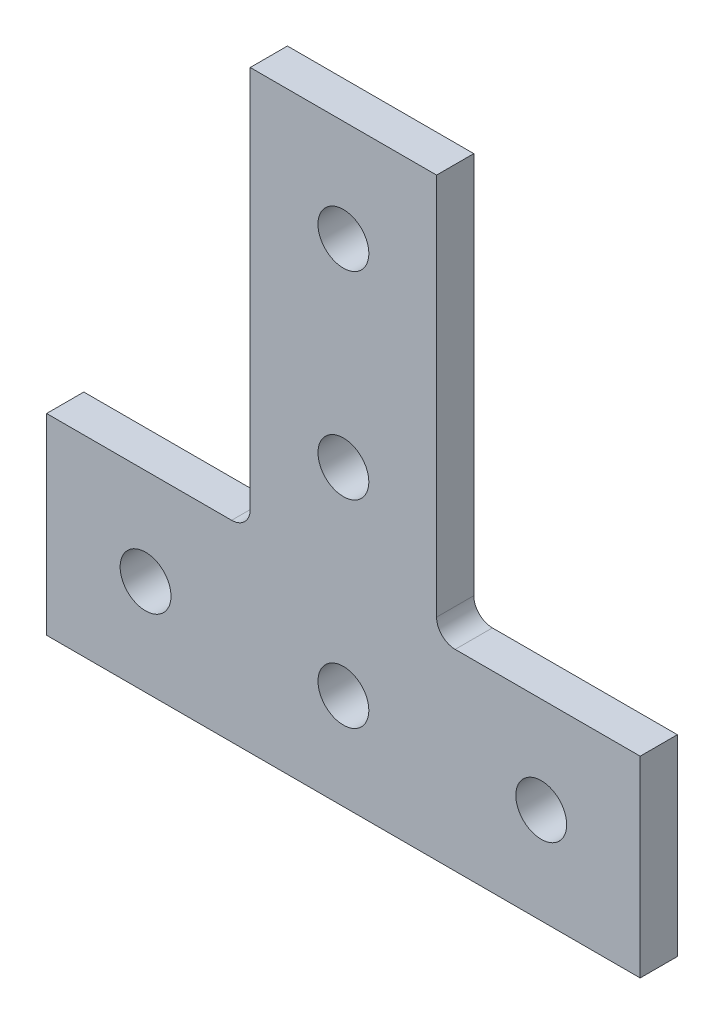
ISO-10303-21;
HEADER;
FILE_DESCRIPTION(('STEP AP214'),'2;1');
FILE_NAME('part.step','',(''),(''),'','','');
FILE_SCHEMA(('AUTOMOTIVE_DESIGN { 1 0 10303 214 1 1 1 1 }'));
ENDSEC;
DATA;
#1=APPLICATION_CONTEXT('core data for automotive mechanical design processes');
#2=APPLICATION_PROTOCOL_DEFINITION('international standard','automotive_design',2000,#1);
#3=PRODUCT_CONTEXT('',#1,'mechanical');
#4=PRODUCT('Part','Part','',(#3));
#5=PRODUCT_RELATED_PRODUCT_CATEGORY('part','',(#4));
#6=PRODUCT_DEFINITION_FORMATION('','',#4);
#7=PRODUCT_DEFINITION_CONTEXT('part definition',#1,'design');
#8=PRODUCT_DEFINITION('design','',#6,#7);
#9=PRODUCT_DEFINITION_SHAPE('','',#8);
#10=(LENGTH_UNIT() NAMED_UNIT(*) SI_UNIT(.MILLI.,.METRE.));
#11=(NAMED_UNIT(*) PLANE_ANGLE_UNIT() SI_UNIT($,.RADIAN.));
#12=(NAMED_UNIT(*) SI_UNIT($,.STERADIAN.) SOLID_ANGLE_UNIT());
#13=UNCERTAINTY_MEASURE_WITH_UNIT(LENGTH_MEASURE(1.E-05),#10,'distance_accuracy_value','');
#14=(GEOMETRIC_REPRESENTATION_CONTEXT(3) GLOBAL_UNCERTAINTY_ASSIGNED_CONTEXT((#13)) GLOBAL_UNIT_ASSIGNED_CONTEXT((#10,
#11,#12)) REPRESENTATION_CONTEXT('',''));
#15=CARTESIAN_POINT('',(0.,0.,0.));
#16=DIRECTION('',(0.,0.,1.));
#17=DIRECTION('',(1.,0.,0.));
#18=AXIS2_PLACEMENT_3D('',#15,#16,#17);
#19=CARTESIAN_POINT('',(-11.9634,-11.049,-2.3876));
#20=DIRECTION('',(-1.,0.,0.));
#21=DIRECTION('',(0.,-1.,0.));
#22=AXIS2_PLACEMENT_3D('',#19,#20,#21);
#23=PLANE('',#22);
#24=DIRECTION('',(0.,0.,1.));
#25=VECTOR('',#24,1.);
#26=CARTESIAN_POINT('',(-11.9634,-11.049,-2.3876));
#27=LINE('',#26,#25);
#28=CARTESIAN_POINT('',(-11.9634,-11.049,-2.3876));
#29=VERTEX_POINT('',#28);
#30=CARTESIAN_POINT('',(-11.9634,-11.049,2.3876));
#31=VERTEX_POINT('',#30);
#32=EDGE_CURVE('E48',#29,#31,#27,.T.);
#33=ORIENTED_EDGE('',*,*,#32,.T.);
#34=DIRECTION('',(0.,-1.,0.));
#35=VECTOR('',#34,1.);
#36=CARTESIAN_POINT('',(-11.9634,-11.049,2.3876));
#37=LINE('',#36,#35);
#38=CARTESIAN_POINT('',(-11.9634,38.1,2.3876));
#39=VERTEX_POINT('',#38);
#40=EDGE_CURVE('E122',#39,#31,#37,.T.);
#41=ORIENTED_EDGE('',*,*,#40,.F.);
#42=DIRECTION('',(0.,0.,1.));
#43=VECTOR('',#42,1.);
#44=CARTESIAN_POINT('',(-11.9634,38.1,-2.3876));
#45=LINE('',#44,#43);
#46=CARTESIAN_POINT('',(-11.9634,38.1,-2.3876));
#47=VERTEX_POINT('',#46);
#48=EDGE_CURVE('E11',#47,#39,#45,.T.);
#49=ORIENTED_EDGE('',*,*,#48,.F.);
#50=DIRECTION('',(0.,-1.,0.));
#51=VECTOR('',#50,1.);
#52=CARTESIAN_POINT('',(-11.9634,-11.049,-2.3876));
#53=LINE('',#52,#51);
#54=EDGE_CURVE('E123',#47,#29,#53,.T.);
#55=ORIENTED_EDGE('',*,*,#54,.T.);
#56=EDGE_LOOP('',(#33,#41,#49,#55));
#57=FACE_BOUND('',#56,.T.);
#58=ADVANCED_FACE('F45',(#57),#23,.T.);
#59=CARTESIAN_POINT('',(11.9634,38.1,-2.3876));
#60=DIRECTION('',(0.,1.,0.));
#61=DIRECTION('',(-1.,0.,0.));
#62=AXIS2_PLACEMENT_3D('',#59,#60,#61);
#63=PLANE('',#62);
#64=ORIENTED_EDGE('',*,*,#48,.T.);
#65=DIRECTION('',(-1.,0.,0.));
#66=VECTOR('',#65,1.);
#67=CARTESIAN_POINT('',(11.9634,38.1,2.3876));
#68=LINE('',#67,#66);
#69=CARTESIAN_POINT('',(11.9634,38.1,2.3876));
#70=VERTEX_POINT('',#69);
#71=EDGE_CURVE('E142',#70,#39,#68,.T.);
#72=ORIENTED_EDGE('',*,*,#71,.F.);
#73=DIRECTION('',(0.,0.,1.));
#74=VECTOR('',#73,1.);
#75=CARTESIAN_POINT('',(11.9634,38.1,-2.3876));
#76=LINE('',#75,#74);
#77=CARTESIAN_POINT('',(11.9634,38.1,-2.3876));
#78=VERTEX_POINT('',#77);
#79=EDGE_CURVE('E54',#78,#70,#76,.T.);
#80=ORIENTED_EDGE('',*,*,#79,.F.);
#81=DIRECTION('',(-1.,0.,0.));
#82=VECTOR('',#81,1.);
#83=CARTESIAN_POINT('',(11.9634,38.1,-2.3876));
#84=LINE('',#83,#82);
#85=EDGE_CURVE('E129',#78,#47,#84,.T.);
#86=ORIENTED_EDGE('',*,*,#85,.T.);
#87=EDGE_LOOP('',(#64,#72,#80,#86));
#88=FACE_BOUND('',#87,.T.);
#89=ADVANCED_FACE('F312',(#88),#63,.T.);
#90=CARTESIAN_POINT('',(11.9634,-11.049,-2.3876));
#91=DIRECTION('',(1.,0.,0.));
#92=DIRECTION('',(0.,1.,0.));
#93=AXIS2_PLACEMENT_3D('',#90,#91,#92);
#94=PLANE('',#93);
#95=ORIENTED_EDGE('',*,*,#79,.T.);
#96=DIRECTION('',(0.,1.,0.));
#97=VECTOR('',#96,1.);
#98=CARTESIAN_POINT('',(11.9634,-11.049,2.3876));
#99=LINE('',#98,#97);
#100=CARTESIAN_POINT('',(11.9634,-11.049,2.3876));
#101=VERTEX_POINT('',#100);
#102=EDGE_CURVE('E177',#101,#70,#99,.T.);
#103=ORIENTED_EDGE('',*,*,#102,.F.);
#104=DIRECTION('',(0.,0.,1.));
#105=VECTOR('',#104,1.);
#106=CARTESIAN_POINT('',(11.9634,-11.049,-2.3876));
#107=LINE('',#106,#105);
#108=CARTESIAN_POINT('',(11.9634,-11.049,-2.3876));
#109=VERTEX_POINT('',#108);
#110=EDGE_CURVE('E218',#109,#101,#107,.T.);
#111=ORIENTED_EDGE('',*,*,#110,.F.);
#112=DIRECTION('',(0.,1.,0.));
#113=VECTOR('',#112,1.);
#114=CARTESIAN_POINT('',(11.9634,-11.049,-2.3876));
#115=LINE('',#114,#113);
#116=EDGE_CURVE('E211',#109,#78,#115,.T.);
#117=ORIENTED_EDGE('',*,*,#116,.T.);
#118=EDGE_LOOP('',(#95,#103,#111,#117));
#119=FACE_BOUND('',#118,.T.);
#120=ADVANCED_FACE('F316',(#119),#94,.T.);
#121=CARTESIAN_POINT('',(14.351,-11.049,-2.3876));
#122=DIRECTION('',(0.,0.,1.));
#123=DIRECTION('',(1.,0.,0.));
#124=AXIS2_PLACEMENT_3D('',#121,#122,#123);
#125=CYLINDRICAL_SURFACE('',#124,2.3876);
#126=ORIENTED_EDGE('',*,*,#110,.T.);
#127=CARTESIAN_POINT('',(14.351,-11.049,2.3876));
#128=DIRECTION('',(0.,0.,-1.));
#129=DIRECTION('',(-1.,0.,0.));
#130=AXIS2_PLACEMENT_3D('',#127,#128,#129);
#131=CIRCLE('',#130,2.3876);
#132=CARTESIAN_POINT('',(14.351,-13.4366,2.3876));
#133=VERTEX_POINT('',#132);
#134=EDGE_CURVE('E173',#133,#101,#131,.T.);
#135=ORIENTED_EDGE('',*,*,#134,.F.);
#136=DIRECTION('',(0.,0.,1.));
#137=VECTOR('',#136,1.);
#138=CARTESIAN_POINT('',(14.351,-13.4366,-2.3876));
#139=LINE('',#138,#137);
#140=CARTESIAN_POINT('',(14.351,-13.4366,-2.3876));
#141=VERTEX_POINT('',#140);
#142=EDGE_CURVE('E221',#141,#133,#139,.T.);
#143=ORIENTED_EDGE('',*,*,#142,.F.);
#144=CARTESIAN_POINT('',(14.351,-11.049,-2.3876));
#145=DIRECTION('',(0.,0.,-1.));
#146=DIRECTION('',(-1.,0.,0.));
#147=AXIS2_PLACEMENT_3D('',#144,#145,#146);
#148=CIRCLE('',#147,2.3876);
#149=EDGE_CURVE('E207',#141,#109,#148,.T.);
#150=ORIENTED_EDGE('',*,*,#149,.T.);
#151=EDGE_LOOP('',(#126,#135,#143,#150));
#152=FACE_BOUND('',#151,.T.);
#153=ADVANCED_FACE('F321',(#152),#125,.F.);
#154=CARTESIAN_POINT('',(38.1,-13.4366,-2.3876));
#155=DIRECTION('',(0.,1.,0.));
#156=DIRECTION('',(0.,0.,1.));
#157=AXIS2_PLACEMENT_3D('',#154,#155,#156);
#158=PLANE('',#157);
#159=ORIENTED_EDGE('',*,*,#142,.T.);
#160=DIRECTION('',(-1.,0.,0.));
#161=VECTOR('',#160,1.);
#162=CARTESIAN_POINT('',(38.1,-13.4366,2.3876));
#163=LINE('',#162,#161);
#164=CARTESIAN_POINT('',(38.1,-13.4366,2.3876));
#165=VERTEX_POINT('',#164);
#166=EDGE_CURVE('E169',#165,#133,#163,.T.);
#167=ORIENTED_EDGE('',*,*,#166,.F.);
#168=DIRECTION('',(0.,0.,1.));
#169=VECTOR('',#168,1.);
#170=CARTESIAN_POINT('',(38.1,-13.4366,-2.3876));
#171=LINE('',#170,#169);
#172=CARTESIAN_POINT('',(38.1,-13.4366,-2.3876));
#173=VERTEX_POINT('',#172);
#174=EDGE_CURVE('E224',#173,#165,#171,.T.);
#175=ORIENTED_EDGE('',*,*,#174,.F.);
#176=DIRECTION('',(-1.,0.,0.));
#177=VECTOR('',#176,1.);
#178=CARTESIAN_POINT('',(38.1,-13.4366,-2.3876));
#179=LINE('',#178,#177);
#180=EDGE_CURVE('E203',#173,#141,#179,.T.);
#181=ORIENTED_EDGE('',*,*,#180,.T.);
#182=EDGE_LOOP('',(#159,#167,#175,#181));
#183=FACE_BOUND('',#182,.T.);
#184=ADVANCED_FACE('F328',(#183),#158,.T.);
#185=CARTESIAN_POINT('',(38.1,-38.1,-2.3876));
#186=DIRECTION('',(1.,0.,0.));
#187=DIRECTION('',(0.,0.,-1.));
#188=AXIS2_PLACEMENT_3D('',#185,#186,#187);
#189=PLANE('',#188);
#190=ORIENTED_EDGE('',*,*,#174,.T.);
#191=DIRECTION('',(0.,1.,0.));
#192=VECTOR('',#191,1.);
#193=CARTESIAN_POINT('',(38.1,-38.1,2.3876));
#194=LINE('',#193,#192);
#195=CARTESIAN_POINT('',(38.1,-38.1,2.3876));
#196=VERTEX_POINT('',#195);
#197=EDGE_CURVE('E165',#196,#165,#194,.T.);
#198=ORIENTED_EDGE('',*,*,#197,.F.);
#199=DIRECTION('',(0.,0.,1.));
#200=VECTOR('',#199,1.);
#201=CARTESIAN_POINT('',(38.1,-38.1,-2.3876));
#202=LINE('',#201,#200);
#203=CARTESIAN_POINT('',(38.1,-38.1,-2.3876));
#204=VERTEX_POINT('',#203);
#205=EDGE_CURVE('E227',#204,#196,#202,.T.);
#206=ORIENTED_EDGE('',*,*,#205,.F.);
#207=DIRECTION('',(0.,1.,0.));
#208=VECTOR('',#207,1.);
#209=CARTESIAN_POINT('',(38.1,-38.1,-2.3876));
#210=LINE('',#209,#208);
#211=EDGE_CURVE('E199',#204,#173,#210,.T.);
#212=ORIENTED_EDGE('',*,*,#211,.T.);
#213=EDGE_LOOP('',(#190,#198,#206,#212));
#214=FACE_BOUND('',#213,.T.);
#215=ADVANCED_FACE('F332',(#214),#189,.T.);
#216=CARTESIAN_POINT('',(38.1,-38.1,-2.3876));
#217=DIRECTION('',(0.,-1.,0.));
#218=DIRECTION('',(1.,0.,0.));
#219=AXIS2_PLACEMENT_3D('',#216,#217,#218);
#220=PLANE('',#219);
#221=ORIENTED_EDGE('',*,*,#205,.T.);
#222=DIRECTION('',(1.,0.,0.));
#223=VECTOR('',#222,1.);
#224=CARTESIAN_POINT('',(38.1,-38.1,2.3876));
#225=LINE('',#224,#223);
#226=CARTESIAN_POINT('',(-38.1,-38.1,2.3876));
#227=VERTEX_POINT('',#226);
#228=EDGE_CURVE('E161',#227,#196,#225,.T.);
#229=ORIENTED_EDGE('',*,*,#228,.F.);
#230=DIRECTION('',(0.,0.,1.));
#231=VECTOR('',#230,1.);
#232=CARTESIAN_POINT('',(-38.1,-38.1,-2.3876));
#233=LINE('',#232,#231);
#234=CARTESIAN_POINT('',(-38.1,-38.1,-2.3876));
#235=VERTEX_POINT('',#234);
#236=EDGE_CURVE('E230',#235,#227,#233,.T.);
#237=ORIENTED_EDGE('',*,*,#236,.F.);
#238=DIRECTION('',(1.,0.,0.));
#239=VECTOR('',#238,1.);
#240=CARTESIAN_POINT('',(38.1,-38.1,-2.3876));
#241=LINE('',#240,#239);
#242=EDGE_CURVE('E195',#235,#204,#241,.T.);
#243=ORIENTED_EDGE('',*,*,#242,.T.);
#244=EDGE_LOOP('',(#221,#229,#237,#243));
#245=FACE_BOUND('',#244,.T.);
#246=ADVANCED_FACE('F336',(#245),#220,.T.);
#247=CARTESIAN_POINT('',(-38.1,-38.1,-2.3876));
#248=DIRECTION('',(-1.,0.,0.));
#249=DIRECTION('',(0.,-1.,0.));
#250=AXIS2_PLACEMENT_3D('',#247,#248,#249);
#251=PLANE('',#250);
#252=ORIENTED_EDGE('',*,*,#236,.T.);
#253=DIRECTION('',(0.,-1.,0.));
#254=VECTOR('',#253,1.);
#255=CARTESIAN_POINT('',(-38.1,-38.1,2.3876));
#256=LINE('',#255,#254);
#257=CARTESIAN_POINT('',(-38.1,-13.4366,2.3876));
#258=VERTEX_POINT('',#257);
#259=EDGE_CURVE('E157',#258,#227,#256,.T.);
#260=ORIENTED_EDGE('',*,*,#259,.F.);
#261=DIRECTION('',(0.,0.,1.));
#262=VECTOR('',#261,1.);
#263=CARTESIAN_POINT('',(-38.1,-13.4366,-2.3876));
#264=LINE('',#263,#262);
#265=CARTESIAN_POINT('',(-38.1,-13.4366,-2.3876));
#266=VERTEX_POINT('',#265);
#267=EDGE_CURVE('E233',#266,#258,#264,.T.);
#268=ORIENTED_EDGE('',*,*,#267,.F.);
#269=DIRECTION('',(0.,-1.,0.));
#270=VECTOR('',#269,1.);
#271=CARTESIAN_POINT('',(-38.1,-38.1,-2.3876));
#272=LINE('',#271,#270);
#273=EDGE_CURVE('E191',#266,#235,#272,.T.);
#274=ORIENTED_EDGE('',*,*,#273,.T.);
#275=EDGE_LOOP('',(#252,#260,#268,#274));
#276=FACE_BOUND('',#275,.T.);
#277=ADVANCED_FACE('F340',(#276),#251,.T.);
#278=CARTESIAN_POINT('',(-38.1,-13.4366,-2.3876));
#279=DIRECTION('',(0.,1.,0.));
#280=DIRECTION('',(0.,0.,1.));
#281=AXIS2_PLACEMENT_3D('',#278,#279,#280);
#282=PLANE('',#281);
#283=ORIENTED_EDGE('',*,*,#267,.T.);
#284=DIRECTION('',(-1.,0.,0.));
#285=VECTOR('',#284,1.);
#286=CARTESIAN_POINT('',(-38.1,-13.4366,2.3876));
#287=LINE('',#286,#285);
#288=CARTESIAN_POINT('',(-14.351,-13.4366,2.3876));
#289=VERTEX_POINT('',#288);
#290=EDGE_CURVE('E137',#289,#258,#287,.T.);
#291=ORIENTED_EDGE('',*,*,#290,.F.);
#292=DIRECTION('',(0.,0.,1.));
#293=VECTOR('',#292,1.);
#294=CARTESIAN_POINT('',(-14.351,-13.4366,-2.3876));
#295=LINE('',#294,#293);
#296=CARTESIAN_POINT('',(-14.351,-13.4366,-2.3876));
#297=VERTEX_POINT('',#296);
#298=EDGE_CURVE('E128',#297,#289,#295,.T.);
#299=ORIENTED_EDGE('',*,*,#298,.F.);
#300=DIRECTION('',(-1.,0.,0.));
#301=VECTOR('',#300,1.);
#302=CARTESIAN_POINT('',(-38.1,-13.4366,-2.3876));
#303=LINE('',#302,#301);
#304=EDGE_CURVE('E187',#297,#266,#303,.T.);
#305=ORIENTED_EDGE('',*,*,#304,.T.);
#306=EDGE_LOOP('',(#283,#291,#299,#305));
#307=FACE_BOUND('',#306,.T.);
#308=ADVANCED_FACE('F344',(#307),#282,.T.);
#309=CARTESIAN_POINT('',(-14.351,-11.049,-2.3876));
#310=DIRECTION('',(0.,0.,1.));
#311=DIRECTION('',(1.,0.,0.));
#312=AXIS2_PLACEMENT_3D('',#309,#310,#311);
#313=CYLINDRICAL_SURFACE('',#312,2.3876);
#314=ORIENTED_EDGE('',*,*,#298,.T.);
#315=CARTESIAN_POINT('',(-14.351,-11.049,2.3876));
#316=DIRECTION('',(0.,0.,-1.));
#317=DIRECTION('',(-1.,0.,0.));
#318=AXIS2_PLACEMENT_3D('',#315,#316,#317);
#319=CIRCLE('',#318,2.3876);
#320=EDGE_CURVE('E131',#31,#289,#319,.T.);
#321=ORIENTED_EDGE('',*,*,#320,.F.);
#322=ORIENTED_EDGE('',*,*,#32,.F.);
#323=CARTESIAN_POINT('',(-14.351,-11.049,-2.3876));
#324=DIRECTION('',(0.,0.,-1.));
#325=DIRECTION('',(-1.,0.,0.));
#326=AXIS2_PLACEMENT_3D('',#323,#324,#325);
#327=CIRCLE('',#326,2.3876);
#328=EDGE_CURVE('E184',#29,#297,#327,.T.);
#329=ORIENTED_EDGE('',*,*,#328,.T.);
#330=EDGE_LOOP('',(#314,#321,#322,#329));
#331=FACE_BOUND('',#330,.T.);
#332=ADVANCED_FACE('F132',(#331),#313,.F.);
#333=CARTESIAN_POINT('',(14.351,-11.049,-2.3876));
#334=DIRECTION('',(0.,0.,-1.));
#335=DIRECTION('',(-1.,0.,0.));
#336=AXIS2_PLACEMENT_3D('',#333,#334,#335);
#337=PLANE('',#336);
#338=CARTESIAN_POINT('',(25.4,-25.7683,-2.3876));
#339=DIRECTION('',(0.,0.,1.));
#340=DIRECTION('',(1.,0.,0.));
#341=AXIS2_PLACEMENT_3D('',#338,#339,#340);
#342=CIRCLE('',#341,3.2639);
#343=CARTESIAN_POINT('',(28.6639,-25.7683,-2.3876));
#344=VERTEX_POINT('',#343);
#345=EDGE_CURVE('E144',#344,#344,#342,.T.);
#346=ORIENTED_EDGE('',*,*,#345,.T.);
#347=EDGE_LOOP('',(#346));
#348=FACE_BOUND('',#347,.T.);
#349=CARTESIAN_POINT('',(0.,-25.7683,-2.3876));
#350=DIRECTION('',(0.,0.,1.));
#351=DIRECTION('',(1.,0.,0.));
#352=AXIS2_PLACEMENT_3D('',#349,#350,#351);
#353=CIRCLE('',#352,3.2639);
#354=CARTESIAN_POINT('',(3.26389999999999,-25.7683,-2.3876));
#355=VERTEX_POINT('',#354);
#356=EDGE_CURVE('E270',#355,#355,#353,.T.);
#357=ORIENTED_EDGE('',*,*,#356,.T.);
#358=EDGE_LOOP('',(#357));
#359=FACE_BOUND('',#358,.T.);
#360=CARTESIAN_POINT('',(-25.4,-25.7683,-2.3876));
#361=DIRECTION('',(0.,0.,1.));
#362=DIRECTION('',(1.,0.,0.));
#363=AXIS2_PLACEMENT_3D('',#360,#361,#362);
#364=CIRCLE('',#363,3.2639);
#365=CARTESIAN_POINT('',(-22.1361,-25.7683,-2.3876));
#366=VERTEX_POINT('',#365);
#367=EDGE_CURVE('E260',#366,#366,#364,.T.);
#368=ORIENTED_EDGE('',*,*,#367,.T.);
#369=EDGE_LOOP('',(#368));
#370=FACE_BOUND('',#369,.T.);
#371=CARTESIAN_POINT('',(0.,-0.368299999999988,-2.3876));
#372=DIRECTION('',(0.,0.,1.));
#373=DIRECTION('',(1.,0.,0.));
#374=AXIS2_PLACEMENT_3D('',#371,#372,#373);
#375=CIRCLE('',#374,3.2639);
#376=CARTESIAN_POINT('',(3.26390000000001,-0.368299999999988,-2.3876));
#377=VERTEX_POINT('',#376);
#378=EDGE_CURVE('E250',#377,#377,#375,.T.);
#379=ORIENTED_EDGE('',*,*,#378,.T.);
#380=EDGE_LOOP('',(#379));
#381=FACE_BOUND('',#380,.T.);
#382=CARTESIAN_POINT('',(0.,25.0317,-2.3876));
#383=DIRECTION('',(0.,0.,1.));
#384=DIRECTION('',(-1.,0.,0.));
#385=AXIS2_PLACEMENT_3D('',#382,#383,#384);
#386=CIRCLE('',#385,3.2639);
#387=CARTESIAN_POINT('',(-3.26390000000002,25.0317,-2.3876));
#388=VERTEX_POINT('',#387);
#389=EDGE_CURVE('E242',#388,#388,#386,.T.);
#390=ORIENTED_EDGE('',*,*,#389,.T.);
#391=EDGE_LOOP('',(#390));
#392=FACE_BOUND('',#391,.T.);
#393=ORIENTED_EDGE('',*,*,#54,.F.);
#394=ORIENTED_EDGE('',*,*,#85,.F.);
#395=ORIENTED_EDGE('',*,*,#116,.F.);
#396=ORIENTED_EDGE('',*,*,#149,.F.);
#397=ORIENTED_EDGE('',*,*,#180,.F.);
#398=ORIENTED_EDGE('',*,*,#211,.F.);
#399=ORIENTED_EDGE('',*,*,#242,.F.);
#400=ORIENTED_EDGE('',*,*,#273,.F.);
#401=ORIENTED_EDGE('',*,*,#304,.F.);
#402=ORIENTED_EDGE('',*,*,#328,.F.);
#403=EDGE_LOOP('',(#393,#394,#395,#396,#397,#398,#399,#400,#401,#402));
#404=FACE_BOUND('',#403,.T.);
#405=ADVANCED_FACE('F290',(#348,#359,#370,#381,#392,#404),#337,.T.);
#406=CARTESIAN_POINT('',(14.351,-11.049,2.3876));
#407=DIRECTION('',(0.,0.,-1.));
#408=DIRECTION('',(-1.,0.,0.));
#409=AXIS2_PLACEMENT_3D('',#406,#407,#408);
#410=PLANE('',#409);
#411=CARTESIAN_POINT('',(25.4,-25.7683,2.3876));
#412=DIRECTION('',(0.,0.,1.));
#413=DIRECTION('',(1.,0.,0.));
#414=AXIS2_PLACEMENT_3D('',#411,#412,#413);
#415=CIRCLE('',#414,3.2639);
#416=CARTESIAN_POINT('',(28.6639,-25.7683,2.3876));
#417=VERTEX_POINT('',#416);
#418=EDGE_CURVE('E149',#417,#417,#415,.T.);
#419=ORIENTED_EDGE('',*,*,#418,.F.);
#420=EDGE_LOOP('',(#419));
#421=FACE_BOUND('',#420,.T.);
#422=CARTESIAN_POINT('',(0.,-25.7683,2.3876));
#423=DIRECTION('',(0.,0.,1.));
#424=DIRECTION('',(1.,0.,0.));
#425=AXIS2_PLACEMENT_3D('',#422,#423,#424);
#426=CIRCLE('',#425,3.2639);
#427=CARTESIAN_POINT('',(3.26389999999999,-25.7683,2.3876));
#428=VERTEX_POINT('',#427);
#429=EDGE_CURVE('E264',#428,#428,#426,.T.);
#430=ORIENTED_EDGE('',*,*,#429,.F.);
#431=EDGE_LOOP('',(#430));
#432=FACE_BOUND('',#431,.T.);
#433=CARTESIAN_POINT('',(-25.4,-25.7683,2.3876));
#434=DIRECTION('',(0.,0.,1.));
#435=DIRECTION('',(1.,0.,0.));
#436=AXIS2_PLACEMENT_3D('',#433,#434,#435);
#437=CIRCLE('',#436,3.2639);
#438=CARTESIAN_POINT('',(-22.1361,-25.7683,2.3876));
#439=VERTEX_POINT('',#438);
#440=EDGE_CURVE('E254',#439,#439,#437,.T.);
#441=ORIENTED_EDGE('',*,*,#440,.F.);
#442=EDGE_LOOP('',(#441));
#443=FACE_BOUND('',#442,.T.);
#444=CARTESIAN_POINT('',(0.,-0.368299999999988,2.3876));
#445=DIRECTION('',(0.,0.,1.));
#446=DIRECTION('',(1.,0.,0.));
#447=AXIS2_PLACEMENT_3D('',#444,#445,#446);
#448=CIRCLE('',#447,3.2639);
#449=CARTESIAN_POINT('',(3.26390000000001,-0.368299999999988,2.3876));
#450=VERTEX_POINT('',#449);
#451=EDGE_CURVE('E246',#450,#450,#448,.T.);
#452=ORIENTED_EDGE('',*,*,#451,.F.);
#453=EDGE_LOOP('',(#452));
#454=FACE_BOUND('',#453,.T.);
#455=CARTESIAN_POINT('',(0.,25.0317,2.3876));
#456=DIRECTION('',(0.,0.,1.));
#457=DIRECTION('',(-1.,0.,0.));
#458=AXIS2_PLACEMENT_3D('',#455,#456,#457);
#459=CIRCLE('',#458,3.2639);
#460=CARTESIAN_POINT('',(-3.26390000000002,25.0317,2.3876));
#461=VERTEX_POINT('',#460);
#462=EDGE_CURVE('E152',#461,#461,#459,.T.);
#463=ORIENTED_EDGE('',*,*,#462,.F.);
#464=EDGE_LOOP('',(#463));
#465=FACE_BOUND('',#464,.T.);
#466=ORIENTED_EDGE('',*,*,#40,.T.);
#467=ORIENTED_EDGE('',*,*,#320,.T.);
#468=ORIENTED_EDGE('',*,*,#290,.T.);
#469=ORIENTED_EDGE('',*,*,#259,.T.);
#470=ORIENTED_EDGE('',*,*,#228,.T.);
#471=ORIENTED_EDGE('',*,*,#197,.T.);
#472=ORIENTED_EDGE('',*,*,#166,.T.);
#473=ORIENTED_EDGE('',*,*,#134,.T.);
#474=ORIENTED_EDGE('',*,*,#102,.T.);
#475=ORIENTED_EDGE('',*,*,#71,.T.);
#476=EDGE_LOOP('',(#466,#467,#468,#469,#470,#471,#472,#473,#474,#475));
#477=FACE_BOUND('',#476,.T.);
#478=ADVANCED_FACE('F140',(#421,#432,#443,#454,#465,#477),#410,.F.);
#479=CARTESIAN_POINT('',(0.,25.0317,-2.3876));
#480=DIRECTION('',(0.,0.,1.));
#481=DIRECTION('',(1.,0.,0.));
#482=AXIS2_PLACEMENT_3D('',#479,#480,#481);
#483=CYLINDRICAL_SURFACE('',#482,3.2639);
#484=ORIENTED_EDGE('',*,*,#389,.F.);
#485=EDGE_LOOP('',(#484));
#486=FACE_BOUND('',#485,.T.);
#487=ORIENTED_EDGE('',*,*,#462,.T.);
#488=EDGE_LOOP('',(#487));
#489=FACE_BOUND('',#488,.T.);
#490=ADVANCED_FACE('F289',(#486,#489),#483,.F.);
#491=CARTESIAN_POINT('',(0.,-0.368299999999988,-2.3876));
#492=DIRECTION('',(0.,0.,1.));
#493=DIRECTION('',(1.,0.,0.));
#494=AXIS2_PLACEMENT_3D('',#491,#492,#493);
#495=CYLINDRICAL_SURFACE('',#494,3.2639);
#496=ORIENTED_EDGE('',*,*,#378,.F.);
#497=EDGE_LOOP('',(#496));
#498=FACE_BOUND('',#497,.T.);
#499=ORIENTED_EDGE('',*,*,#451,.T.);
#500=EDGE_LOOP('',(#499));
#501=FACE_BOUND('',#500,.T.);
#502=ADVANCED_FACE('F301',(#498,#501),#495,.F.);
#503=CARTESIAN_POINT('',(-25.4,-25.7683,-2.3876));
#504=DIRECTION('',(0.,0.,1.));
#505=DIRECTION('',(1.,0.,0.));
#506=AXIS2_PLACEMENT_3D('',#503,#504,#505);
#507=CYLINDRICAL_SURFACE('',#506,3.2639);
#508=ORIENTED_EDGE('',*,*,#367,.F.);
#509=EDGE_LOOP('',(#508));
#510=FACE_BOUND('',#509,.T.);
#511=ORIENTED_EDGE('',*,*,#440,.T.);
#512=EDGE_LOOP('',(#511));
#513=FACE_BOUND('',#512,.T.);
#514=ADVANCED_FACE('F307',(#510,#513),#507,.F.);
#515=CARTESIAN_POINT('',(0.,-25.7683,-2.3876));
#516=DIRECTION('',(0.,0.,1.));
#517=DIRECTION('',(1.,0.,0.));
#518=AXIS2_PLACEMENT_3D('',#515,#516,#517);
#519=CYLINDRICAL_SURFACE('',#518,3.2639);
#520=ORIENTED_EDGE('',*,*,#356,.F.);
#521=EDGE_LOOP('',(#520));
#522=FACE_BOUND('',#521,.T.);
#523=ORIENTED_EDGE('',*,*,#429,.T.);
#524=EDGE_LOOP('',(#523));
#525=FACE_BOUND('',#524,.T.);
#526=ADVANCED_FACE('F382',(#522,#525),#519,.F.);
#527=CARTESIAN_POINT('',(25.4,-25.7683,-2.3876));
#528=DIRECTION('',(0.,0.,1.));
#529=DIRECTION('',(1.,0.,0.));
#530=AXIS2_PLACEMENT_3D('',#527,#528,#529);
#531=CYLINDRICAL_SURFACE('',#530,3.2639);
#532=ORIENTED_EDGE('',*,*,#345,.F.);
#533=EDGE_LOOP('',(#532));
#534=FACE_BOUND('',#533,.T.);
#535=ORIENTED_EDGE('',*,*,#418,.T.);
#536=EDGE_LOOP('',(#535));
#537=FACE_BOUND('',#536,.T.);
#538=ADVANCED_FACE('F285',(#534,#537),#531,.F.);
#539=CLOSED_SHELL('',(#58,#89,#120,#153,#184,#215,#246,#277,#308,#332,#405,#478,#490,#502,#514,
#526,#538));
#540=MANIFOLD_SOLID_BREP('B2',#539);
#541=ADVANCED_BREP_SHAPE_REPRESENTATION('',(#18,#540),#14);
#542=SHAPE_DEFINITION_REPRESENTATION(#9,#541);
ENDSEC;
END-ISO-10303-21;
